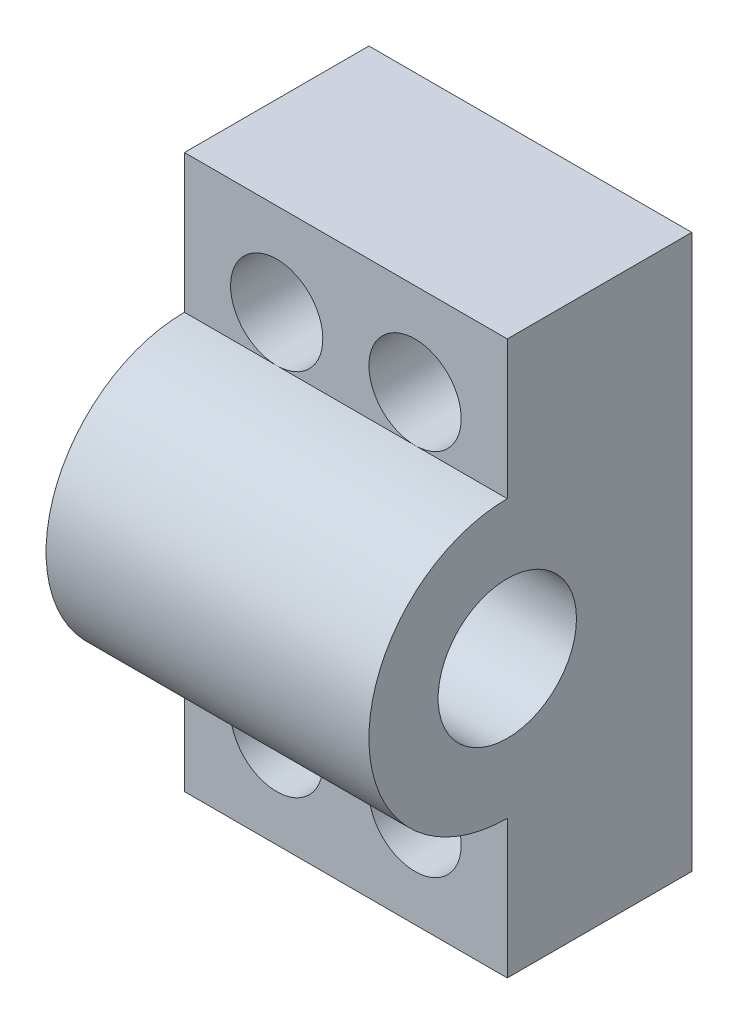
ISO-10303-21;
HEADER;
FILE_DESCRIPTION(('STEP AP214'),'2;1');
FILE_NAME('part.step','',(''),(''),'','','');
FILE_SCHEMA(('AUTOMOTIVE_DESIGN { 1 0 10303 214 1 1 1 1 }'));
ENDSEC;
DATA;
#1=APPLICATION_CONTEXT('core data for automotive mechanical design processes');
#2=APPLICATION_PROTOCOL_DEFINITION('international standard','automotive_design',2000,#1);
#3=PRODUCT_CONTEXT('',#1,'mechanical');
#4=PRODUCT('Part','Part','',(#3));
#5=PRODUCT_RELATED_PRODUCT_CATEGORY('part','',(#4));
#6=PRODUCT_DEFINITION_FORMATION('','',#4);
#7=PRODUCT_DEFINITION_CONTEXT('part definition',#1,'design');
#8=PRODUCT_DEFINITION('design','',#6,#7);
#9=PRODUCT_DEFINITION_SHAPE('','',#8);
#10=(LENGTH_UNIT() NAMED_UNIT(*) SI_UNIT(.MILLI.,.METRE.));
#11=(NAMED_UNIT(*) PLANE_ANGLE_UNIT() SI_UNIT($,.RADIAN.));
#12=(NAMED_UNIT(*) SI_UNIT($,.STERADIAN.) SOLID_ANGLE_UNIT());
#13=UNCERTAINTY_MEASURE_WITH_UNIT(LENGTH_MEASURE(1.E-05),#10,'distance_accuracy_value','');
#14=(GEOMETRIC_REPRESENTATION_CONTEXT(3) GLOBAL_UNCERTAINTY_ASSIGNED_CONTEXT((#13)) GLOBAL_UNIT_ASSIGNED_CONTEXT((#10,
#11,#12)) REPRESENTATION_CONTEXT('',''));
#15=CARTESIAN_POINT('',(0.,0.,0.));
#16=DIRECTION('',(0.,0.,1.));
#17=DIRECTION('',(1.,0.,0.));
#18=AXIS2_PLACEMENT_3D('',#15,#16,#17);
#19=CARTESIAN_POINT('',(35.,30.,0.));
#20=DIRECTION('',(0.,-1.,0.));
#21=DIRECTION('',(0.,0.,-1.));
#22=AXIS2_PLACEMENT_3D('',#19,#20,#21);
#23=PLANE('',#22);
#24=DIRECTION('',(0.,0.,1.));
#25=VECTOR('',#24,1.);
#26=CARTESIAN_POINT('',(0.,30.,0.));
#27=LINE('',#26,#25);
#28=CARTESIAN_POINT('',(0.,30.,0.));
#29=VERTEX_POINT('',#28);
#30=CARTESIAN_POINT('',(0.,30.,20.));
#31=VERTEX_POINT('',#30);
#32=EDGE_CURVE('E120',#29,#31,#27,.T.);
#33=ORIENTED_EDGE('',*,*,#32,.T.);
#34=DIRECTION('',(-1.,0.,0.));
#35=VECTOR('',#34,1.);
#36=CARTESIAN_POINT('',(35.,30.,20.));
#37=LINE('',#36,#35);
#38=CARTESIAN_POINT('',(35.,30.,20.));
#39=VERTEX_POINT('',#38);
#40=EDGE_CURVE('E11',#39,#31,#37,.T.);
#41=ORIENTED_EDGE('',*,*,#40,.F.);
#42=DIRECTION('',(0.,0.,1.));
#43=VECTOR('',#42,1.);
#44=CARTESIAN_POINT('',(35.,30.,0.));
#45=LINE('',#44,#43);
#46=CARTESIAN_POINT('',(35.,30.,0.));
#47=VERTEX_POINT('',#46);
#48=EDGE_CURVE('E108',#47,#39,#45,.T.);
#49=ORIENTED_EDGE('',*,*,#48,.F.);
#50=DIRECTION('',(-1.,0.,0.));
#51=VECTOR('',#50,1.);
#52=CARTESIAN_POINT('',(35.,30.,0.));
#53=LINE('',#52,#51);
#54=EDGE_CURVE('E121',#47,#29,#53,.T.);
#55=ORIENTED_EDGE('',*,*,#54,.T.);
#56=EDGE_LOOP('',(#33,#41,#49,#55));
#57=FACE_BOUND('',#56,.T.);
#58=ADVANCED_FACE('F35',(#57),#23,.F.);
#59=CARTESIAN_POINT('',(35.,30.,20.));
#60=DIRECTION('',(0.,0.,-1.));
#61=DIRECTION('',(-1.,0.,0.));
#62=AXIS2_PLACEMENT_3D('',#59,#60,#61);
#63=PLANE('',#62);
#64=DIRECTION('',(-1.,0.,0.));
#65=VECTOR('',#64,1.);
#66=CARTESIAN_POINT('',(35.,15.,20.));
#67=LINE('',#66,#65);
#68=CARTESIAN_POINT('',(25.,15.,20.));
#69=VERTEX_POINT('',#68);
#70=CARTESIAN_POINT('',(10.,15.,20.));
#71=VERTEX_POINT('',#70);
#72=EDGE_CURVE('E153',#69,#71,#67,.T.);
#73=ORIENTED_EDGE('',*,*,#72,.F.);
#74=CARTESIAN_POINT('',(25.,20.,20.));
#75=DIRECTION('',(0.,0.,-1.));
#76=DIRECTION('',(-1.,0.,0.));
#77=AXIS2_PLACEMENT_3D('',#74,#75,#76);
#78=CIRCLE('',#77,5.);
#79=EDGE_CURVE('E53',#69,#69,#78,.F.);
#80=ORIENTED_EDGE('',*,*,#79,.F.);
#81=CARTESIAN_POINT('',(35.,15.,20.));
#82=VERTEX_POINT('',#81);
#83=EDGE_CURVE('E43',#82,#69,#67,.T.);
#84=ORIENTED_EDGE('',*,*,#83,.F.);
#85=DIRECTION('',(0.,-1.,0.));
#86=VECTOR('',#85,1.);
#87=CARTESIAN_POINT('',(35.,30.,20.));
#88=LINE('',#87,#86);
#89=EDGE_CURVE('E97',#39,#82,#88,.T.);
#90=ORIENTED_EDGE('',*,*,#89,.F.);
#91=ORIENTED_EDGE('',*,*,#40,.T.);
#92=DIRECTION('',(0.,-1.,0.));
#93=VECTOR('',#92,1.);
#94=CARTESIAN_POINT('',(0.,30.,20.));
#95=LINE('',#94,#93);
#96=CARTESIAN_POINT('',(0.,15.,20.));
#97=VERTEX_POINT('',#96);
#98=EDGE_CURVE('E124',#31,#97,#95,.T.);
#99=ORIENTED_EDGE('',*,*,#98,.T.);
#100=EDGE_CURVE('E151',#71,#97,#67,.T.);
#101=ORIENTED_EDGE('',*,*,#100,.F.);
#102=CARTESIAN_POINT('',(10.,20.,20.));
#103=DIRECTION('',(0.,0.,-1.));
#104=DIRECTION('',(-1.,0.,0.));
#105=AXIS2_PLACEMENT_3D('',#102,#103,#104);
#106=CIRCLE('',#105,5.);
#107=EDGE_CURVE('E48',#71,#71,#106,.F.);
#108=ORIENTED_EDGE('',*,*,#107,.F.);
#109=EDGE_LOOP('',(#73,#80,#84,#90,#91,#99,#101,#108));
#110=FACE_BOUND('',#109,.T.);
#111=ADVANCED_FACE('F100',(#110),#63,.F.);
#112=CARTESIAN_POINT('',(35.,0.,20.));
#113=DIRECTION('',(-1.,0.,0.));
#114=DIRECTION('',(0.,0.,1.));
#115=AXIS2_PLACEMENT_3D('',#112,#113,#114);
#116=CYLINDRICAL_SURFACE('',#115,15.);
#117=CARTESIAN_POINT('',(0.,0.,20.));
#118=DIRECTION('',(1.,0.,0.));
#119=DIRECTION('',(0.,0.,-1.));
#120=AXIS2_PLACEMENT_3D('',#117,#118,#119);
#121=CIRCLE('',#120,15.);
#122=CARTESIAN_POINT('',(0.,-15.,20.));
#123=VERTEX_POINT('',#122);
#124=EDGE_CURVE('E126',#97,#123,#121,.T.);
#125=ORIENTED_EDGE('',*,*,#124,.T.);
#126=DIRECTION('',(-1.,0.,0.));
#127=VECTOR('',#126,1.);
#128=CARTESIAN_POINT('',(35.,-15.,20.));
#129=LINE('',#128,#127);
#130=CARTESIAN_POINT('',(10.,-15.,20.));
#131=VERTEX_POINT('',#130);
#132=EDGE_CURVE('E147',#131,#123,#129,.T.);
#133=ORIENTED_EDGE('',*,*,#132,.F.);
#134=CARTESIAN_POINT('',(25.,-15.,20.));
#135=VERTEX_POINT('',#134);
#136=EDGE_CURVE('E152',#135,#131,#129,.T.);
#137=ORIENTED_EDGE('',*,*,#136,.F.);
#138=CARTESIAN_POINT('',(35.,-15.,20.));
#139=VERTEX_POINT('',#138);
#140=EDGE_CURVE('E148',#139,#135,#129,.T.);
#141=ORIENTED_EDGE('',*,*,#140,.F.);
#142=CARTESIAN_POINT('',(35.,0.,20.));
#143=DIRECTION('',(1.,0.,0.));
#144=DIRECTION('',(0.,0.,-1.));
#145=AXIS2_PLACEMENT_3D('',#142,#143,#144);
#146=CIRCLE('',#145,15.);
#147=EDGE_CURVE('E107',#82,#139,#146,.T.);
#148=ORIENTED_EDGE('',*,*,#147,.F.);
#149=ORIENTED_EDGE('',*,*,#83,.T.);
#150=ORIENTED_EDGE('',*,*,#72,.T.);
#151=ORIENTED_EDGE('',*,*,#100,.T.);
#152=EDGE_LOOP('',(#125,#133,#137,#141,#148,#149,#150,#151));
#153=FACE_BOUND('',#152,.T.);
#154=ADVANCED_FACE('F157',(#153),#116,.T.);
#155=CARTESIAN_POINT('',(35.,-15.,20.));
#156=DIRECTION('',(0.,0.,-1.));
#157=DIRECTION('',(0.,1.,0.));
#158=AXIS2_PLACEMENT_3D('',#155,#156,#157);
#159=PLANE('',#158);
#160=ORIENTED_EDGE('',*,*,#136,.T.);
#161=CARTESIAN_POINT('',(10.,-20.,20.));
#162=DIRECTION('',(0.,0.,-1.));
#163=DIRECTION('',(0.,1.,0.));
#164=AXIS2_PLACEMENT_3D('',#161,#162,#163);
#165=CIRCLE('',#164,5.);
#166=EDGE_CURVE('E128',#131,#131,#165,.F.);
#167=ORIENTED_EDGE('',*,*,#166,.F.);
#168=ORIENTED_EDGE('',*,*,#132,.T.);
#169=DIRECTION('',(0.,-1.,0.));
#170=VECTOR('',#169,1.);
#171=CARTESIAN_POINT('',(0.,-15.,20.));
#172=LINE('',#171,#170);
#173=CARTESIAN_POINT('',(0.,-30.,20.));
#174=VERTEX_POINT('',#173);
#175=EDGE_CURVE('E135',#123,#174,#172,.T.);
#176=ORIENTED_EDGE('',*,*,#175,.T.);
#177=DIRECTION('',(-1.,0.,0.));
#178=VECTOR('',#177,1.);
#179=CARTESIAN_POINT('',(35.,-30.,20.));
#180=LINE('',#179,#178);
#181=CARTESIAN_POINT('',(35.,-30.,20.));
#182=VERTEX_POINT('',#181);
#183=EDGE_CURVE('E144',#182,#174,#180,.T.);
#184=ORIENTED_EDGE('',*,*,#183,.F.);
#185=DIRECTION('',(0.,-1.,0.));
#186=VECTOR('',#185,1.);
#187=CARTESIAN_POINT('',(35.,-15.,20.));
#188=LINE('',#187,#186);
#189=EDGE_CURVE('E174',#139,#182,#188,.T.);
#190=ORIENTED_EDGE('',*,*,#189,.F.);
#191=ORIENTED_EDGE('',*,*,#140,.T.);
#192=CARTESIAN_POINT('',(25.,-20.,20.));
#193=DIRECTION('',(0.,0.,-1.));
#194=DIRECTION('',(0.,1.,0.));
#195=AXIS2_PLACEMENT_3D('',#192,#193,#194);
#196=CIRCLE('',#195,5.);
#197=EDGE_CURVE('E179',#135,#135,#196,.F.);
#198=ORIENTED_EDGE('',*,*,#197,.F.);
#199=EDGE_LOOP('',(#160,#167,#168,#176,#184,#190,#191,#198));
#200=FACE_BOUND('',#199,.T.);
#201=ADVANCED_FACE('F166',(#200),#159,.F.);
#202=CARTESIAN_POINT('',(35.,-30.,20.));
#203=DIRECTION('',(0.,1.,0.));
#204=DIRECTION('',(0.,0.,1.));
#205=AXIS2_PLACEMENT_3D('',#202,#203,#204);
#206=PLANE('',#205);
#207=DIRECTION('',(0.,0.,-1.));
#208=VECTOR('',#207,1.);
#209=CARTESIAN_POINT('',(0.,-30.,20.));
#210=LINE('',#209,#208);
#211=CARTESIAN_POINT('',(0.,-30.,0.));
#212=VERTEX_POINT('',#211);
#213=EDGE_CURVE('E137',#174,#212,#210,.T.);
#214=ORIENTED_EDGE('',*,*,#213,.T.);
#215=DIRECTION('',(-1.,0.,0.));
#216=VECTOR('',#215,1.);
#217=CARTESIAN_POINT('',(35.,-30.,0.));
#218=LINE('',#217,#216);
#219=CARTESIAN_POINT('',(35.,-30.,0.));
#220=VERTEX_POINT('',#219);
#221=EDGE_CURVE('E141',#220,#212,#218,.T.);
#222=ORIENTED_EDGE('',*,*,#221,.F.);
#223=DIRECTION('',(0.,0.,-1.));
#224=VECTOR('',#223,1.);
#225=CARTESIAN_POINT('',(35.,-30.,20.));
#226=LINE('',#225,#224);
#227=EDGE_CURVE('E173',#182,#220,#226,.T.);
#228=ORIENTED_EDGE('',*,*,#227,.F.);
#229=ORIENTED_EDGE('',*,*,#183,.T.);
#230=EDGE_LOOP('',(#214,#222,#228,#229));
#231=FACE_BOUND('',#230,.T.);
#232=ADVANCED_FACE('F171',(#231),#206,.F.);
#233=CARTESIAN_POINT('',(35.,-30.,0.));
#234=DIRECTION('',(0.,0.,1.));
#235=DIRECTION('',(0.,-1.,0.));
#236=AXIS2_PLACEMENT_3D('',#233,#234,#235);
#237=PLANE('',#236);
#238=CARTESIAN_POINT('',(25.,20.,0.));
#239=DIRECTION('',(0.,0.,1.));
#240=DIRECTION('',(1.,0.,0.));
#241=AXIS2_PLACEMENT_3D('',#238,#239,#240);
#242=CIRCLE('',#241,5.);
#243=CARTESIAN_POINT('',(30.,20.,0.));
#244=VERTEX_POINT('',#243);
#245=EDGE_CURVE('E185',#244,#244,#242,.T.);
#246=ORIENTED_EDGE('',*,*,#245,.T.);
#247=EDGE_LOOP('',(#246));
#248=FACE_BOUND('',#247,.T.);
#249=CARTESIAN_POINT('',(10.,-20.,0.));
#250=DIRECTION('',(0.,0.,1.));
#251=DIRECTION('',(1.,0.,0.));
#252=AXIS2_PLACEMENT_3D('',#249,#250,#251);
#253=CIRCLE('',#252,5.);
#254=CARTESIAN_POINT('',(15.,-20.,0.));
#255=VERTEX_POINT('',#254);
#256=EDGE_CURVE('E186',#255,#255,#253,.T.);
#257=ORIENTED_EDGE('',*,*,#256,.T.);
#258=EDGE_LOOP('',(#257));
#259=FACE_BOUND('',#258,.T.);
#260=CARTESIAN_POINT('',(25.,-20.,0.));
#261=DIRECTION('',(0.,0.,1.));
#262=DIRECTION('',(1.,0.,0.));
#263=AXIS2_PLACEMENT_3D('',#260,#261,#262);
#264=CIRCLE('',#263,5.);
#265=CARTESIAN_POINT('',(30.,-20.,0.));
#266=VERTEX_POINT('',#265);
#267=EDGE_CURVE('E189',#266,#266,#264,.T.);
#268=ORIENTED_EDGE('',*,*,#267,.T.);
#269=EDGE_LOOP('',(#268));
#270=FACE_BOUND('',#269,.T.);
#271=CARTESIAN_POINT('',(10.,20.,0.));
#272=DIRECTION('',(0.,0.,1.));
#273=DIRECTION('',(1.,0.,0.));
#274=AXIS2_PLACEMENT_3D('',#271,#272,#273);
#275=CIRCLE('',#274,5.);
#276=CARTESIAN_POINT('',(15.,20.,0.));
#277=VERTEX_POINT('',#276);
#278=EDGE_CURVE('E182',#277,#277,#275,.T.);
#279=ORIENTED_EDGE('',*,*,#278,.T.);
#280=EDGE_LOOP('',(#279));
#281=FACE_BOUND('',#280,.T.);
#282=DIRECTION('',(0.,1.,0.));
#283=VECTOR('',#282,1.);
#284=CARTESIAN_POINT('',(0.,-30.,0.));
#285=LINE('',#284,#283);
#286=EDGE_CURVE('E117',#212,#29,#285,.T.);
#287=ORIENTED_EDGE('',*,*,#286,.T.);
#288=ORIENTED_EDGE('',*,*,#54,.F.);
#289=DIRECTION('',(0.,1.,0.));
#290=VECTOR('',#289,1.);
#291=CARTESIAN_POINT('',(35.,-30.,0.));
#292=LINE('',#291,#290);
#293=EDGE_CURVE('E113',#220,#47,#292,.T.);
#294=ORIENTED_EDGE('',*,*,#293,.F.);
#295=ORIENTED_EDGE('',*,*,#221,.T.);
#296=EDGE_LOOP('',(#287,#288,#294,#295));
#297=FACE_BOUND('',#296,.T.);
#298=ADVANCED_FACE('F226',(#248,#259,#270,#281,#297),#237,.F.);
#299=CARTESIAN_POINT('',(35.,0.,20.));
#300=DIRECTION('',(1.,0.,0.));
#301=DIRECTION('',(0.,0.,-1.));
#302=AXIS2_PLACEMENT_3D('',#299,#300,#301);
#303=PLANE('',#302);
#304=CARTESIAN_POINT('',(35.,0.,20.));
#305=DIRECTION('',(1.,0.,0.));
#306=DIRECTION('',(0.,0.,-1.));
#307=AXIS2_PLACEMENT_3D('',#304,#305,#306);
#308=CIRCLE('',#307,7.5);
#309=CARTESIAN_POINT('',(35.,0.,12.5));
#310=VERTEX_POINT('',#309);
#311=EDGE_CURVE('E194',#310,#310,#308,.T.);
#312=ORIENTED_EDGE('',*,*,#311,.F.);
#313=EDGE_LOOP('',(#312));
#314=FACE_BOUND('',#313,.T.);
#315=ORIENTED_EDGE('',*,*,#48,.T.);
#316=ORIENTED_EDGE('',*,*,#89,.T.);
#317=ORIENTED_EDGE('',*,*,#147,.T.);
#318=ORIENTED_EDGE('',*,*,#189,.T.);
#319=ORIENTED_EDGE('',*,*,#227,.T.);
#320=ORIENTED_EDGE('',*,*,#293,.T.);
#321=EDGE_LOOP('',(#315,#316,#317,#318,#319,#320));
#322=FACE_BOUND('',#321,.T.);
#323=ADVANCED_FACE('F111',(#314,#322),#303,.T.);
#324=CARTESIAN_POINT('',(0.,0.,20.));
#325=DIRECTION('',(1.,0.,0.));
#326=DIRECTION('',(0.,0.,-1.));
#327=AXIS2_PLACEMENT_3D('',#324,#325,#326);
#328=PLANE('',#327);
#329=CARTESIAN_POINT('',(0.,0.,20.));
#330=DIRECTION('',(1.,0.,0.));
#331=DIRECTION('',(0.,0.,-1.));
#332=AXIS2_PLACEMENT_3D('',#329,#330,#331);
#333=CIRCLE('',#332,7.5);
#334=CARTESIAN_POINT('',(0.,0.,12.5));
#335=VERTEX_POINT('',#334);
#336=EDGE_CURVE('E38',#335,#335,#333,.T.);
#337=ORIENTED_EDGE('',*,*,#336,.T.);
#338=EDGE_LOOP('',(#337));
#339=FACE_BOUND('',#338,.T.);
#340=ORIENTED_EDGE('',*,*,#32,.F.);
#341=ORIENTED_EDGE('',*,*,#286,.F.);
#342=ORIENTED_EDGE('',*,*,#213,.F.);
#343=ORIENTED_EDGE('',*,*,#175,.F.);
#344=ORIENTED_EDGE('',*,*,#124,.F.);
#345=ORIENTED_EDGE('',*,*,#98,.F.);
#346=EDGE_LOOP('',(#340,#341,#342,#343,#344,#345));
#347=FACE_BOUND('',#346,.T.);
#348=ADVANCED_FACE('F161',(#339,#347),#328,.F.);
#349=CARTESIAN_POINT('',(10.,20.,35.));
#350=DIRECTION('',(0.,0.,-1.));
#351=DIRECTION('',(-1.,0.,0.));
#352=AXIS2_PLACEMENT_3D('',#349,#350,#351);
#353=CYLINDRICAL_SURFACE('',#352,5.);
#354=ORIENTED_EDGE('',*,*,#278,.F.);
#355=EDGE_LOOP('',(#354));
#356=FACE_BOUND('',#355,.T.);
#357=ORIENTED_EDGE('',*,*,#107,.T.);
#358=EDGE_LOOP('',(#357));
#359=FACE_BOUND('',#358,.T.);
#360=ADVANCED_FACE('F232',(#356,#359),#353,.F.);
#361=CARTESIAN_POINT('',(25.,-20.,35.));
#362=DIRECTION('',(0.,0.,-1.));
#363=DIRECTION('',(-1.,0.,0.));
#364=AXIS2_PLACEMENT_3D('',#361,#362,#363);
#365=CYLINDRICAL_SURFACE('',#364,5.);
#366=ORIENTED_EDGE('',*,*,#267,.F.);
#367=EDGE_LOOP('',(#366));
#368=FACE_BOUND('',#367,.T.);
#369=ORIENTED_EDGE('',*,*,#197,.T.);
#370=EDGE_LOOP('',(#369));
#371=FACE_BOUND('',#370,.T.);
#372=ADVANCED_FACE('F238',(#368,#371),#365,.F.);
#373=CARTESIAN_POINT('',(10.,-20.,35.));
#374=DIRECTION('',(0.,0.,-1.));
#375=DIRECTION('',(-1.,0.,0.));
#376=AXIS2_PLACEMENT_3D('',#373,#374,#375);
#377=CYLINDRICAL_SURFACE('',#376,5.);
#378=ORIENTED_EDGE('',*,*,#256,.F.);
#379=EDGE_LOOP('',(#378));
#380=FACE_BOUND('',#379,.T.);
#381=ORIENTED_EDGE('',*,*,#166,.T.);
#382=EDGE_LOOP('',(#381));
#383=FACE_BOUND('',#382,.T.);
#384=ADVANCED_FACE('F209',(#380,#383),#377,.F.);
#385=CARTESIAN_POINT('',(25.,20.,35.));
#386=DIRECTION('',(0.,0.,-1.));
#387=DIRECTION('',(-1.,0.,0.));
#388=AXIS2_PLACEMENT_3D('',#385,#386,#387);
#389=CYLINDRICAL_SURFACE('',#388,5.);
#390=ORIENTED_EDGE('',*,*,#245,.F.);
#391=EDGE_LOOP('',(#390));
#392=FACE_BOUND('',#391,.T.);
#393=ORIENTED_EDGE('',*,*,#79,.T.);
#394=EDGE_LOOP('',(#393));
#395=FACE_BOUND('',#394,.T.);
#396=ADVANCED_FACE('F204',(#392,#395),#389,.F.);
#397=CARTESIAN_POINT('',(-5.,0.,20.));
#398=DIRECTION('',(1.,0.,0.));
#399=DIRECTION('',(0.,0.,-1.));
#400=AXIS2_PLACEMENT_3D('',#397,#398,#399);
#401=CYLINDRICAL_SURFACE('',#400,7.5);
#402=ORIENTED_EDGE('',*,*,#311,.T.);
#403=EDGE_LOOP('',(#402));
#404=FACE_BOUND('',#403,.T.);
#405=ORIENTED_EDGE('',*,*,#336,.F.);
#406=EDGE_LOOP('',(#405));
#407=FACE_BOUND('',#406,.T.);
#408=ADVANCED_FACE('F202',(#404,#407),#401,.F.);
#409=CLOSED_SHELL('',(#58,#111,#154,#201,#232,#298,#323,#348,#360,#372,#384,#396,#408));
#410=MANIFOLD_SOLID_BREP('B2',#409);
#411=ADVANCED_BREP_SHAPE_REPRESENTATION('',(#18,#410),#14);
#412=SHAPE_DEFINITION_REPRESENTATION(#9,#411);
ENDSEC;
END-ISO-10303-21;
